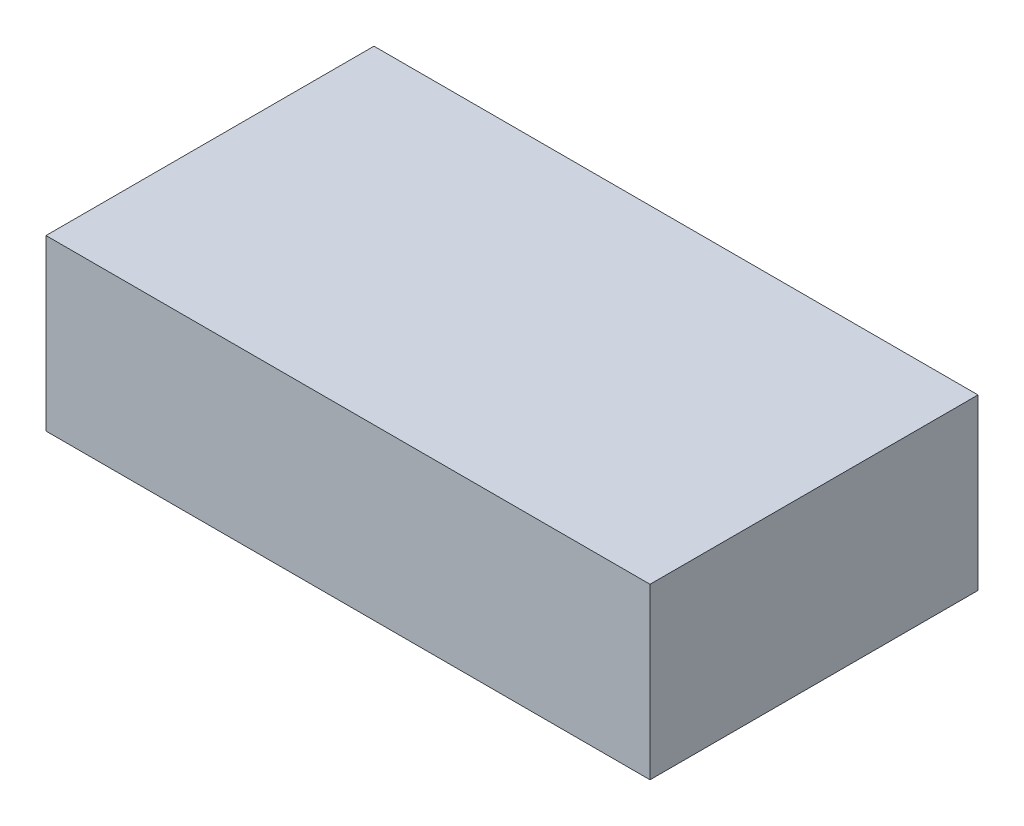
ISO-10303-21;
HEADER;
FILE_DESCRIPTION(('STEP AP214'),'2;1');
FILE_NAME('part.step','',(''),(''),'','','');
FILE_SCHEMA(('AUTOMOTIVE_DESIGN { 1 0 10303 214 1 1 1 1 }'));
ENDSEC;
DATA;
#1=APPLICATION_CONTEXT('core data for automotive mechanical design processes');
#2=APPLICATION_PROTOCOL_DEFINITION('international standard','automotive_design',2000,#1);
#3=PRODUCT_CONTEXT('',#1,'mechanical');
#4=PRODUCT('Part','Part','',(#3));
#5=PRODUCT_RELATED_PRODUCT_CATEGORY('part','',(#4));
#6=PRODUCT_DEFINITION_FORMATION('','',#4);
#7=PRODUCT_DEFINITION_CONTEXT('part definition',#1,'design');
#8=PRODUCT_DEFINITION('design','',#6,#7);
#9=PRODUCT_DEFINITION_SHAPE('','',#8);
#10=(LENGTH_UNIT() NAMED_UNIT(*) SI_UNIT(.MILLI.,.METRE.));
#11=(NAMED_UNIT(*) PLANE_ANGLE_UNIT() SI_UNIT($,.RADIAN.));
#12=(NAMED_UNIT(*) SI_UNIT($,.STERADIAN.) SOLID_ANGLE_UNIT());
#13=UNCERTAINTY_MEASURE_WITH_UNIT(LENGTH_MEASURE(1.E-05),#10,'distance_accuracy_value','');
#14=(GEOMETRIC_REPRESENTATION_CONTEXT(3) GLOBAL_UNCERTAINTY_ASSIGNED_CONTEXT((#13)) GLOBAL_UNIT_ASSIGNED_CONTEXT((#10,
#11,#12)) REPRESENTATION_CONTEXT('',''));
#15=CARTESIAN_POINT('',(0.,0.,0.));
#16=DIRECTION('',(0.,0.,1.));
#17=DIRECTION('',(1.,0.,0.));
#18=AXIS2_PLACEMENT_3D('',#15,#16,#17);
#19=CARTESIAN_POINT('',(38.215,21.43,0.));
#20=DIRECTION('',(-1.,0.,0.));
#21=DIRECTION('',(0.,0.,1.));
#22=AXIS2_PLACEMENT_3D('',#19,#20,#21);
#23=PLANE('',#22);
#24=DIRECTION('',(0.,0.,-1.));
#25=VECTOR('',#24,1.);
#26=CARTESIAN_POINT('',(38.215,0.,0.));
#27=LINE('',#26,#25);
#28=CARTESIAN_POINT('',(38.215,0.,0.));
#29=VERTEX_POINT('',#28);
#30=CARTESIAN_POINT('',(38.215,0.,-41.5));
#31=VERTEX_POINT('',#30);
#32=EDGE_CURVE('E96',#29,#31,#27,.T.);
#33=ORIENTED_EDGE('',*,*,#32,.T.);
#34=DIRECTION('',(0.,-1.,0.));
#35=VECTOR('',#34,1.);
#36=CARTESIAN_POINT('',(38.215,21.43,-41.5));
#37=LINE('',#36,#35);
#38=CARTESIAN_POINT('',(38.215,21.43,-41.5));
#39=VERTEX_POINT('',#38);
#40=EDGE_CURVE('E11',#39,#31,#37,.T.);
#41=ORIENTED_EDGE('',*,*,#40,.F.);
#42=DIRECTION('',(0.,0.,-1.));
#43=VECTOR('',#42,1.);
#44=CARTESIAN_POINT('',(38.215,21.43,0.));
#45=LINE('',#44,#43);
#46=CARTESIAN_POINT('',(38.215,21.43,0.));
#47=VERTEX_POINT('',#46);
#48=EDGE_CURVE('E82',#47,#39,#45,.T.);
#49=ORIENTED_EDGE('',*,*,#48,.F.);
#50=DIRECTION('',(0.,-1.,0.));
#51=VECTOR('',#50,1.);
#52=CARTESIAN_POINT('',(38.215,21.43,0.));
#53=LINE('',#52,#51);
#54=EDGE_CURVE('E49',#47,#29,#53,.T.);
#55=ORIENTED_EDGE('',*,*,#54,.T.);
#56=EDGE_LOOP('',(#33,#41,#49,#55));
#57=FACE_BOUND('',#56,.T.);
#58=ADVANCED_FACE('F33',(#57),#23,.F.);
#59=CARTESIAN_POINT('',(38.215,21.43,-41.5));
#60=DIRECTION('',(0.,0.,1.));
#61=DIRECTION('',(1.,0.,0.));
#62=AXIS2_PLACEMENT_3D('',#59,#60,#61);
#63=PLANE('',#62);
#64=DIRECTION('',(-1.,0.,0.));
#65=VECTOR('',#64,1.);
#66=CARTESIAN_POINT('',(38.215,0.,-41.5));
#67=LINE('',#66,#65);
#68=CARTESIAN_POINT('',(-38.215,0.,-41.5));
#69=VERTEX_POINT('',#68);
#70=EDGE_CURVE('E87',#31,#69,#67,.T.);
#71=ORIENTED_EDGE('',*,*,#70,.T.);
#72=DIRECTION('',(0.,-1.,0.));
#73=VECTOR('',#72,1.);
#74=CARTESIAN_POINT('',(-38.215,21.43,-41.5));
#75=LINE('',#74,#73);
#76=CARTESIAN_POINT('',(-38.215,21.43,-41.5));
#77=VERTEX_POINT('',#76);
#78=EDGE_CURVE('E41',#77,#69,#75,.T.);
#79=ORIENTED_EDGE('',*,*,#78,.F.);
#80=DIRECTION('',(-1.,0.,0.));
#81=VECTOR('',#80,1.);
#82=CARTESIAN_POINT('',(38.215,21.43,-41.5));
#83=LINE('',#82,#81);
#84=EDGE_CURVE('E75',#39,#77,#83,.T.);
#85=ORIENTED_EDGE('',*,*,#84,.F.);
#86=ORIENTED_EDGE('',*,*,#40,.T.);
#87=EDGE_LOOP('',(#71,#79,#85,#86));
#88=FACE_BOUND('',#87,.T.);
#89=ADVANCED_FACE('F86',(#88),#63,.F.);
#90=CARTESIAN_POINT('',(-38.215,21.43,-41.5));
#91=DIRECTION('',(1.,0.,0.));
#92=DIRECTION('',(0.,0.,-1.));
#93=AXIS2_PLACEMENT_3D('',#90,#91,#92);
#94=PLANE('',#93);
#95=DIRECTION('',(0.,0.,1.));
#96=VECTOR('',#95,1.);
#97=CARTESIAN_POINT('',(-38.215,0.,-41.5));
#98=LINE('',#97,#96);
#99=CARTESIAN_POINT('',(-38.215,0.,0.));
#100=VERTEX_POINT('',#99);
#101=EDGE_CURVE('E99',#69,#100,#98,.T.);
#102=ORIENTED_EDGE('',*,*,#101,.T.);
#103=DIRECTION('',(0.,-1.,0.));
#104=VECTOR('',#103,1.);
#105=CARTESIAN_POINT('',(-38.215,21.43,0.));
#106=LINE('',#105,#104);
#107=CARTESIAN_POINT('',(-38.215,21.43,0.));
#108=VERTEX_POINT('',#107);
#109=EDGE_CURVE('E64',#108,#100,#106,.T.);
#110=ORIENTED_EDGE('',*,*,#109,.F.);
#111=DIRECTION('',(0.,0.,1.));
#112=VECTOR('',#111,1.);
#113=CARTESIAN_POINT('',(-38.215,21.43,-41.5));
#114=LINE('',#113,#112);
#115=EDGE_CURVE('E81',#77,#108,#114,.T.);
#116=ORIENTED_EDGE('',*,*,#115,.F.);
#117=ORIENTED_EDGE('',*,*,#78,.T.);
#118=EDGE_LOOP('',(#102,#110,#116,#117));
#119=FACE_BOUND('',#118,.T.);
#120=ADVANCED_FACE('F90',(#119),#94,.F.);
#121=CARTESIAN_POINT('',(38.215,21.43,0.));
#122=DIRECTION('',(0.,0.,1.));
#123=DIRECTION('',(1.,0.,0.));
#124=AXIS2_PLACEMENT_3D('',#121,#122,#123);
#125=PLANE('',#124);
#126=DIRECTION('',(-1.,0.,0.));
#127=VECTOR('',#126,1.);
#128=CARTESIAN_POINT('',(38.215,0.,0.));
#129=LINE('',#128,#127);
#130=EDGE_CURVE('E101',#29,#100,#129,.T.);
#131=ORIENTED_EDGE('',*,*,#130,.F.);
#132=ORIENTED_EDGE('',*,*,#54,.F.);
#133=DIRECTION('',(-1.,0.,0.));
#134=VECTOR('',#133,1.);
#135=CARTESIAN_POINT('',(38.215,21.43,0.));
#136=LINE('',#135,#134);
#137=EDGE_CURVE('E91',#47,#108,#136,.T.);
#138=ORIENTED_EDGE('',*,*,#137,.T.);
#139=ORIENTED_EDGE('',*,*,#109,.T.);
#140=EDGE_LOOP('',(#131,#132,#138,#139));
#141=FACE_BOUND('',#140,.T.);
#142=ADVANCED_FACE('F107',(#141),#125,.T.);
#143=CARTESIAN_POINT('',(0.,21.43,0.));
#144=DIRECTION('',(0.,1.,0.));
#145=DIRECTION('',(0.,0.,1.));
#146=AXIS2_PLACEMENT_3D('',#143,#144,#145);
#147=PLANE('',#146);
#148=ORIENTED_EDGE('',*,*,#48,.T.);
#149=ORIENTED_EDGE('',*,*,#84,.T.);
#150=ORIENTED_EDGE('',*,*,#115,.T.);
#151=ORIENTED_EDGE('',*,*,#137,.F.);
#152=EDGE_LOOP('',(#148,#149,#150,#151));
#153=FACE_BOUND('',#152,.T.);
#154=ADVANCED_FACE('F78',(#153),#147,.T.);
#155=CARTESIAN_POINT('',(0.,0.,0.));
#156=DIRECTION('',(0.,1.,0.));
#157=DIRECTION('',(0.,0.,1.));
#158=AXIS2_PLACEMENT_3D('',#155,#156,#157);
#159=PLANE('',#158);
#160=ORIENTED_EDGE('',*,*,#32,.F.);
#161=ORIENTED_EDGE('',*,*,#130,.T.);
#162=ORIENTED_EDGE('',*,*,#101,.F.);
#163=ORIENTED_EDGE('',*,*,#70,.F.);
#164=EDGE_LOOP('',(#160,#161,#162,#163));
#165=FACE_BOUND('',#164,.T.);
#166=ADVANCED_FACE('F106',(#165),#159,.F.);
#167=CLOSED_SHELL('',(#58,#89,#120,#142,#154,#166));
#168=MANIFOLD_SOLID_BREP('B2',#167);
#169=ADVANCED_BREP_SHAPE_REPRESENTATION('',(#18,#168),#14);
#170=SHAPE_DEFINITION_REPRESENTATION(#9,#169);
ENDSEC;
END-ISO-10303-21;
